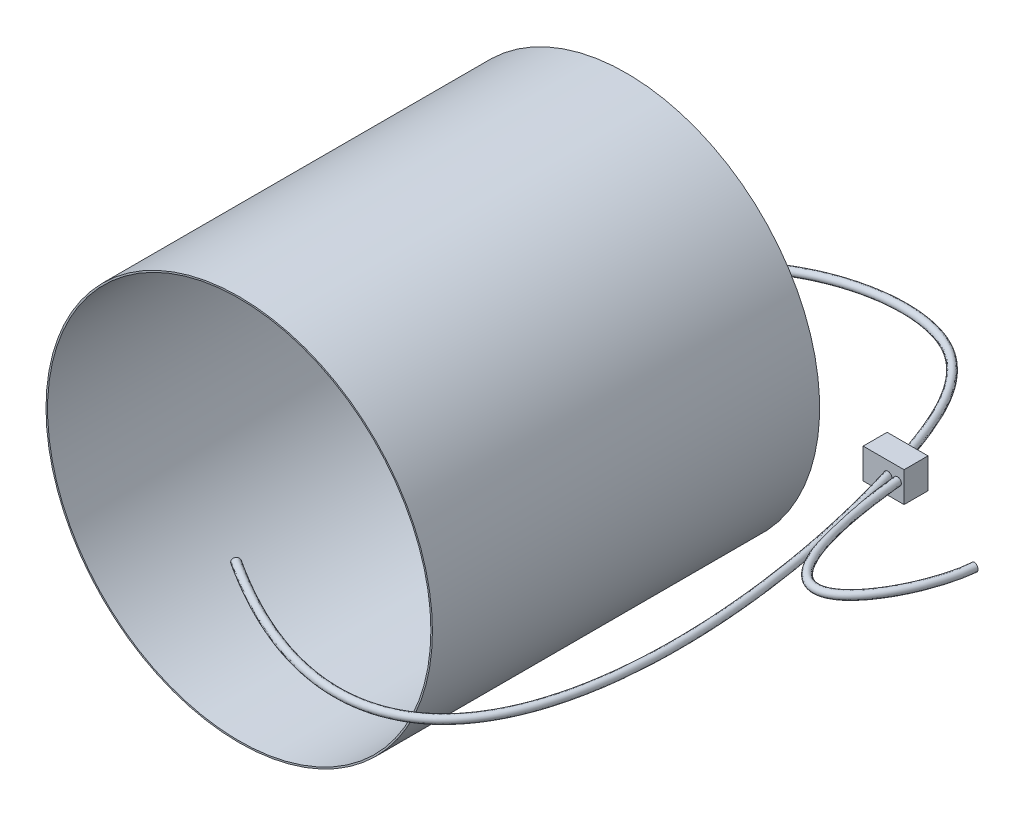
ISO-10303-21;
HEADER;
FILE_DESCRIPTION(('STEP AP214'),'2;1');
FILE_NAME('part.step','',(''),(''),'','','');
FILE_SCHEMA(('AUTOMOTIVE_DESIGN { 1 0 10303 214 1 1 1 1 }'));
ENDSEC;
DATA;
#1=APPLICATION_CONTEXT('core data for automotive mechanical design processes');
#2=APPLICATION_PROTOCOL_DEFINITION('international standard','automotive_design',2000,#1);
#3=PRODUCT_CONTEXT('',#1,'mechanical');
#4=PRODUCT('Part','Part','',(#3));
#5=PRODUCT_RELATED_PRODUCT_CATEGORY('part','',(#4));
#6=PRODUCT_DEFINITION_FORMATION('','',#4);
#7=PRODUCT_DEFINITION_CONTEXT('part definition',#1,'design');
#8=PRODUCT_DEFINITION('design','',#6,#7);
#9=PRODUCT_DEFINITION_SHAPE('','',#8);
#10=(LENGTH_UNIT() NAMED_UNIT(*) SI_UNIT(.MILLI.,.METRE.));
#11=(NAMED_UNIT(*) PLANE_ANGLE_UNIT() SI_UNIT($,.RADIAN.));
#12=(NAMED_UNIT(*) SI_UNIT($,.STERADIAN.) SOLID_ANGLE_UNIT());
#13=UNCERTAINTY_MEASURE_WITH_UNIT(LENGTH_MEASURE(1.E-05),#10,'distance_accuracy_value','');
#14=(GEOMETRIC_REPRESENTATION_CONTEXT(3) GLOBAL_UNCERTAINTY_ASSIGNED_CONTEXT((#13)) GLOBAL_UNIT_ASSIGNED_CONTEXT((#10,
#11,#12)) REPRESENTATION_CONTEXT('',''));
#15=CARTESIAN_POINT('',(0.,0.,0.));
#16=DIRECTION('',(0.,0.,1.));
#17=DIRECTION('',(1.,0.,0.));
#18=AXIS2_PLACEMENT_3D('',#15,#16,#17);
#19=CARTESIAN_POINT('',(338.302574557478,17.1512584107072,31.));
#20=DIRECTION('',(1.,0.,0.));
#21=DIRECTION('',(0.,0.,-1.));
#22=AXIS2_PLACEMENT_3D('',#19,#20,#21);
#23=PLANE('',#22);
#24=DIRECTION('',(0.,-1.,0.));
#25=VECTOR('',#24,1.);
#26=CARTESIAN_POINT('',(338.302574557478,17.1512584107072,0.));
#27=LINE('',#26,#25);
#28=CARTESIAN_POINT('',(338.302574557478,17.1512584107072,0.));
#29=VERTEX_POINT('',#28);
#30=CARTESIAN_POINT('',(338.302574557478,-21.9980250572279,0.));
#31=VERTEX_POINT('',#30);
#32=EDGE_CURVE('E99',#29,#31,#27,.T.);
#33=ORIENTED_EDGE('',*,*,#32,.T.);
#34=DIRECTION('',(0.,0.,-1.));
#35=VECTOR('',#34,1.);
#36=CARTESIAN_POINT('',(338.302574557478,-21.9980250572279,31.));
#37=LINE('',#36,#35);
#38=CARTESIAN_POINT('',(338.302574557478,-21.9980250572279,31.));
#39=VERTEX_POINT('',#38);
#40=EDGE_CURVE('E45',#39,#31,#37,.T.);
#41=ORIENTED_EDGE('',*,*,#40,.F.);
#42=DIRECTION('',(0.,-1.,0.));
#43=VECTOR('',#42,1.);
#44=CARTESIAN_POINT('',(338.302574557478,17.1512584107072,31.));
#45=LINE('',#44,#43);
#46=CARTESIAN_POINT('',(338.302574557478,17.1512584107072,31.));
#47=VERTEX_POINT('',#46);
#48=EDGE_CURVE('E105',#47,#39,#45,.T.);
#49=ORIENTED_EDGE('',*,*,#48,.F.);
#50=DIRECTION('',(0.,0.,-1.));
#51=VECTOR('',#50,1.);
#52=CARTESIAN_POINT('',(338.302574557478,17.1512584107072,31.));
#53=LINE('',#52,#51);
#54=EDGE_CURVE('E110',#47,#29,#53,.T.);
#55=ORIENTED_EDGE('',*,*,#54,.T.);
#56=EDGE_LOOP('',(#33,#41,#49,#55));
#57=FACE_BOUND('',#56,.T.);
#58=ADVANCED_FACE('F42',(#57),#23,.F.);
#59=CARTESIAN_POINT('',(338.302574557478,-21.9980250572279,31.));
#60=DIRECTION('',(0.,1.,0.));
#61=DIRECTION('',(0.,0.,1.));
#62=AXIS2_PLACEMENT_3D('',#59,#60,#61);
#63=PLANE('',#62);
#64=DIRECTION('',(1.,0.,0.));
#65=VECTOR('',#64,1.);
#66=CARTESIAN_POINT('',(338.302574557478,-21.9980250572279,0.));
#67=LINE('',#66,#65);
#68=CARTESIAN_POINT('',(391.218351464605,-21.9980250572279,0.));
#69=VERTEX_POINT('',#68);
#70=EDGE_CURVE('E102',#31,#69,#67,.T.);
#71=ORIENTED_EDGE('',*,*,#70,.T.);
#72=DIRECTION('',(0.,0.,-1.));
#73=VECTOR('',#72,1.);
#74=CARTESIAN_POINT('',(391.218351464605,-21.9980250572279,31.));
#75=LINE('',#74,#73);
#76=CARTESIAN_POINT('',(391.218351464605,-21.9980250572279,31.));
#77=VERTEX_POINT('',#76);
#78=EDGE_CURVE('E117',#77,#69,#75,.T.);
#79=ORIENTED_EDGE('',*,*,#78,.F.);
#80=DIRECTION('',(1.,0.,0.));
#81=VECTOR('',#80,1.);
#82=CARTESIAN_POINT('',(338.302574557478,-21.9980250572279,31.));
#83=LINE('',#82,#81);
#84=EDGE_CURVE('E91',#39,#77,#83,.T.);
#85=ORIENTED_EDGE('',*,*,#84,.F.);
#86=ORIENTED_EDGE('',*,*,#40,.T.);
#87=EDGE_LOOP('',(#71,#79,#85,#86));
#88=FACE_BOUND('',#87,.T.);
#89=ADVANCED_FACE('F120',(#88),#63,.F.);
#90=CARTESIAN_POINT('',(391.218351464605,17.1512584107072,31.));
#91=DIRECTION('',(-1.,0.,0.));
#92=DIRECTION('',(0.,0.,1.));
#93=AXIS2_PLACEMENT_3D('',#90,#91,#92);
#94=PLANE('',#93);
#95=DIRECTION('',(0.,1.,0.));
#96=VECTOR('',#95,1.);
#97=CARTESIAN_POINT('',(391.218351464605,17.1512584107072,0.));
#98=LINE('',#97,#96);
#99=CARTESIAN_POINT('',(391.218351464605,17.1512584107072,0.));
#100=VERTEX_POINT('',#99);
#101=EDGE_CURVE('E77',#69,#100,#98,.T.);
#102=ORIENTED_EDGE('',*,*,#101,.T.);
#103=DIRECTION('',(0.,0.,-1.));
#104=VECTOR('',#103,1.);
#105=CARTESIAN_POINT('',(391.218351464605,17.1512584107072,31.));
#106=LINE('',#105,#104);
#107=CARTESIAN_POINT('',(391.218351464605,17.1512584107072,31.));
#108=VERTEX_POINT('',#107);
#109=EDGE_CURVE('E116',#108,#100,#106,.T.);
#110=ORIENTED_EDGE('',*,*,#109,.F.);
#111=DIRECTION('',(0.,1.,0.));
#112=VECTOR('',#111,1.);
#113=CARTESIAN_POINT('',(391.218351464605,17.1512584107072,31.));
#114=LINE('',#113,#112);
#115=EDGE_CURVE('E108',#77,#108,#114,.T.);
#116=ORIENTED_EDGE('',*,*,#115,.F.);
#117=ORIENTED_EDGE('',*,*,#78,.T.);
#118=EDGE_LOOP('',(#102,#110,#116,#117));
#119=FACE_BOUND('',#118,.T.);
#120=ADVANCED_FACE('F145',(#119),#94,.F.);
#121=CARTESIAN_POINT('',(338.302574557478,17.1512584107072,31.));
#122=DIRECTION('',(0.,-1.,0.));
#123=DIRECTION('',(0.,0.,-1.));
#124=AXIS2_PLACEMENT_3D('',#121,#122,#123);
#125=PLANE('',#124);
#126=DIRECTION('',(-1.,0.,0.));
#127=VECTOR('',#126,1.);
#128=CARTESIAN_POINT('',(338.302574557478,17.1512584107072,0.));
#129=LINE('',#128,#127);
#130=EDGE_CURVE('E83',#100,#29,#129,.T.);
#131=ORIENTED_EDGE('',*,*,#130,.T.);
#132=ORIENTED_EDGE('',*,*,#54,.F.);
#133=DIRECTION('',(-1.,0.,0.));
#134=VECTOR('',#133,1.);
#135=CARTESIAN_POINT('',(338.302574557478,17.1512584107072,31.));
#136=LINE('',#135,#134);
#137=EDGE_CURVE('E59',#108,#47,#136,.T.);
#138=ORIENTED_EDGE('',*,*,#137,.F.);
#139=ORIENTED_EDGE('',*,*,#109,.T.);
#140=EDGE_LOOP('',(#131,#132,#138,#139));
#141=FACE_BOUND('',#140,.T.);
#142=ADVANCED_FACE('F135',(#141),#125,.F.);
#143=CARTESIAN_POINT('',(0.,0.,31.));
#144=DIRECTION('',(0.,0.,1.));
#145=DIRECTION('',(1.,0.,0.));
#146=AXIS2_PLACEMENT_3D('',#143,#144,#145);
#147=PLANE('',#146);
#148=CARTESIAN_POINT('',(382.708659892026,0.,31.));
#149=DIRECTION('',(0.,0.,1.));
#150=DIRECTION('',(1.,0.,0.));
#151=AXIS2_PLACEMENT_3D('',#148,#149,#150);
#152=CIRCLE('',#151,4.99999999999999);
#153=CARTESIAN_POINT('',(387.708659892026,0.,31.));
#154=VERTEX_POINT('',#153);
#155=EDGE_CURVE('E12',#154,#154,#152,.T.);
#156=ORIENTED_EDGE('',*,*,#155,.F.);
#157=EDGE_LOOP('',(#156));
#158=FACE_BOUND('',#157,.T.);
#159=ORIENTED_EDGE('',*,*,#48,.T.);
#160=ORIENTED_EDGE('',*,*,#84,.T.);
#161=ORIENTED_EDGE('',*,*,#115,.T.);
#162=ORIENTED_EDGE('',*,*,#137,.T.);
#163=EDGE_LOOP('',(#159,#160,#161,#162));
#164=FACE_BOUND('',#163,.T.);
#165=ADVANCED_FACE('F127',(#158,#164),#147,.T.);
#166=CARTESIAN_POINT('',(0.,0.,0.));
#167=DIRECTION('',(0.,0.,1.));
#168=DIRECTION('',(1.,0.,0.));
#169=AXIS2_PLACEMENT_3D('',#166,#167,#168);
#170=PLANE('',#169);
#171=ORIENTED_EDGE('',*,*,#32,.F.);
#172=ORIENTED_EDGE('',*,*,#130,.F.);
#173=ORIENTED_EDGE('',*,*,#101,.F.);
#174=ORIENTED_EDGE('',*,*,#70,.F.);
#175=EDGE_LOOP('',(#171,#172,#173,#174));
#176=FACE_BOUND('',#175,.T.);
#177=ADVANCED_FACE('F125',(#176),#170,.F.);
#178=CARTESIAN_POINT('',(528.966952554239,0.,77.0978475005213));
#179=DIRECTION('',(0.178166893070489,0.,-0.984000283645086));
#180=DIRECTION('',(-0.984000283645086,0.,-0.178166893070489));
#181=AXIS2_PLACEMENT_3D('',#178,#179,#180);
#182=PLANE('',#181);
#183=CARTESIAN_POINT('',(528.966952554239,0.,77.0978475005213));
#184=DIRECTION('',(0.178166893070489,0.,-0.984000283645086));
#185=DIRECTION('',(-0.984000283645086,0.,-0.178166893070489));
#186=AXIS2_PLACEMENT_3D('',#183,#184,#185);
#187=CIRCLE('',#186,4.99999999999999);
#188=CARTESIAN_POINT('',(524.046951136013,0.,76.2070130351689));
#189=VERTEX_POINT('',#188);
#190=EDGE_CURVE('E96',#189,#189,#187,.T.);
#191=ORIENTED_EDGE('',*,*,#190,.T.);
#192=EDGE_LOOP('',(#191));
#193=FACE_BOUND('',#192,.T.);
#194=ADVANCED_FACE('F97',(#193),#182,.T.);
#195=CARTESIAN_POINT('',(387.708659892026,0.,31.));
#196=CARTESIAN_POINT('',(391.661472107941,0.,69.4023058030883));
#197=CARTESIAN_POINT('',(396.809414964593,0.,100.103749865182));
#198=CARTESIAN_POINT('',(408.727187505509,0.,148.292164886655));
#199=CARTESIAN_POINT('',(415.519472751265,0.,165.778206598089));
#200=CARTESIAN_POINT('',(426.102157344031,0.,183.622398636411));
#201=CARTESIAN_POINT('',(429.688360441044,0.,188.166708605779));
#202=CARTESIAN_POINT('',(436.724624873369,0.,194.790027303583));
#203=CARTESIAN_POINT('',(440.154819260295,0.,196.866935713956));
#204=CARTESIAN_POINT('',(446.769499376555,0.,199.178905140237));
#205=CARTESIAN_POINT('',(449.971859622662,0.,199.447610877982));
#206=CARTESIAN_POINT('',(456.563295910827,0.,198.556415249598));
#207=CARTESIAN_POINT('',(459.967239373909,0.,197.367487583561));
#208=CARTESIAN_POINT('',(466.973944309957,0.,193.519074129686));
#209=CARTESIAN_POINT('',(470.56109249647,0.,190.858574648087));
#210=CARTESIAN_POINT('',(477.698048187122,0.,184.264753590476));
#211=CARTESIAN_POINT('',(481.246497577332,0.,180.335461191755));
#212=CARTESIAN_POINT('',(491.588124472667,0.,167.078632113022));
#213=CARTESIAN_POINT('',(498.071201186594,0.,156.285751039266));
#214=CARTESIAN_POINT('',(509.301617064936,0.,133.197895495766));
#215=CARTESIAN_POINT('',(514.056249846722,0.,120.901129197843));
#216=CARTESIAN_POINT('',(521.084415400655,0.,97.2257813197254));
#217=CARTESIAN_POINT('',(523.353664153003,0.,85.8338514195964));
#218=CARTESIAN_POINT('',(524.046951136013,0.,76.2070130351689));
#219=CARTESIAN_POINT('',(387.708659892026,9.99999999999998,31.));
#220=CARTESIAN_POINT('',(391.661472107941,9.99999999999998,69.4023058030883));
#221=CARTESIAN_POINT('',(396.809414964593,9.99999999999998,100.103749865182));
#222=CARTESIAN_POINT('',(408.727187505509,9.99999999999998,148.292164886655));
#223=CARTESIAN_POINT('',(415.519472751265,9.99999999999998,165.778206598089));
#224=CARTESIAN_POINT('',(426.102157344031,9.99999999999998,183.622398636411));
#225=CARTESIAN_POINT('',(429.688360441044,9.99999999999998,188.166708605779));
#226=CARTESIAN_POINT('',(436.72462487337,9.99999999999998,194.790027303583));
#227=CARTESIAN_POINT('',(440.154819260295,9.99999999999998,196.866935713956));
#228=CARTESIAN_POINT('',(446.769499376555,9.99999999999998,199.178905140237));
#229=CARTESIAN_POINT('',(449.971859622662,9.99999999999998,199.447610877982));
#230=CARTESIAN_POINT('',(456.563295910827,9.99999999999998,198.556415249598));
#231=CARTESIAN_POINT('',(459.967239373909,9.99999999999998,197.367487583561));
#232=CARTESIAN_POINT('',(466.973944309957,9.99999999999998,193.519074129686));
#233=CARTESIAN_POINT('',(470.56109249647,9.99999999999998,190.858574648087));
#234=CARTESIAN_POINT('',(477.698048187122,9.99999999999998,184.264753590476));
#235=CARTESIAN_POINT('',(481.246497577332,9.99999999999998,180.335461191755));
#236=CARTESIAN_POINT('',(491.588124472667,9.99999999999998,167.078632113022));
#237=CARTESIAN_POINT('',(498.071201186594,9.99999999999998,156.285751039266));
#238=CARTESIAN_POINT('',(509.301617064936,9.99999999999998,133.197895495766));
#239=CARTESIAN_POINT('',(514.056249846722,9.99999999999998,120.901129197843));
#240=CARTESIAN_POINT('',(521.084415400655,9.99999999999998,97.2257813197254));
#241=CARTESIAN_POINT('',(523.353664153003,9.99999999999998,85.8338514195964));
#242=CARTESIAN_POINT('',(524.046951136013,9.99999999999998,76.2070130351688));
#243=CARTESIAN_POINT('',(377.708659892026,9.99999999999998,31.));
#244=CARTESIAN_POINT('',(381.661472107941,9.99999999999998,69.7417569729615));
#245=CARTESIAN_POINT('',(386.81845239686,9.99999999999998,100.864618812219));
#246=CARTESIAN_POINT('',(398.911140211257,9.99999999999998,150.303003053876));
#247=CARTESIAN_POINT('',(405.824392162172,9.99999999999998,168.619454697616));
#248=CARTESIAN_POINT('',(417.301986332703,9.99999999999998,188.425919195469));
#249=CARTESIAN_POINT('',(421.319538313041,9.99999999999998,193.756314151096));
#250=CARTESIAN_POINT('',(429.816693764479,9.99999999999998,202.108590123261));
#251=CARTESIAN_POINT('',(434.316164181494,9.99999999999998,205.1325714543));
#252=CARTESIAN_POINT('',(443.711975466634,9.99999999999998,208.825778978414));
#253=CARTESIAN_POINT('',(448.590441820276,9.99999999999998,209.461360447702));
#254=CARTESIAN_POINT('',(458.137072597184,9.99999999999998,208.541740609979));
#255=CARTESIAN_POINT('',(462.790369599453,9.99999999999998,207.015565599186));
#256=CARTESIAN_POINT('',(471.699811533746,9.99999999999998,202.391596469071));
#257=CARTESIAN_POINT('',(475.971569750655,9.99999999999998,199.294816040627));
#258=CARTESIAN_POINT('',(484.179344876291,9.99999999999998,191.909112699167));
#259=CARTESIAN_POINT('',(488.116719899132,9.99999999999998,187.616160604542));
#260=CARTESIAN_POINT('',(499.410821362281,9.99999999999998,173.3746283122));
#261=CARTESIAN_POINT('',(506.255903714969,9.99999999999998,162.059764603428));
#262=CARTESIAN_POINT('',(518.092502860762,9.99999999999998,137.998824061341));
#263=CARTESIAN_POINT('',(523.07672603836,9.99999999999998,125.254539052342));
#264=CARTESIAN_POINT('',(530.538985855073,9.99999999999998,100.532178997147));
#265=CARTESIAN_POINT('',(533.021306516796,9.99999999999998,88.5674522716136));
#266=CARTESIAN_POINT('',(533.886953972464,9.99999999999998,77.9886819658738));
#267=CARTESIAN_POINT('',(377.708659892026,0.,31.));
#268=CARTESIAN_POINT('',(381.661472107941,0.,69.7417569729615));
#269=CARTESIAN_POINT('',(386.81845239686,0.,100.864618812219));
#270=CARTESIAN_POINT('',(398.911140211257,0.,150.303003053876));
#271=CARTESIAN_POINT('',(405.824392162172,0.,168.619454697616));
#272=CARTESIAN_POINT('',(417.301986332703,0.,188.425919195469));
#273=CARTESIAN_POINT('',(421.319538313041,0.,193.756314151096));
#274=CARTESIAN_POINT('',(429.816693764479,0.,202.108590123261));
#275=CARTESIAN_POINT('',(434.316164181494,0.,205.1325714543));
#276=CARTESIAN_POINT('',(443.711975466634,0.,208.825778978414));
#277=CARTESIAN_POINT('',(448.590441820276,0.,209.461360447702));
#278=CARTESIAN_POINT('',(458.137072597184,0.,208.541740609979));
#279=CARTESIAN_POINT('',(462.790369599453,0.,207.015565599186));
#280=CARTESIAN_POINT('',(471.699811533746,0.,202.391596469071));
#281=CARTESIAN_POINT('',(475.971569750655,0.,199.294816040627));
#282=CARTESIAN_POINT('',(484.179344876291,0.,191.909112699167));
#283=CARTESIAN_POINT('',(488.116719899132,0.,187.616160604542));
#284=CARTESIAN_POINT('',(499.410821362281,0.,173.3746283122));
#285=CARTESIAN_POINT('',(506.255903714969,0.,162.059764603428));
#286=CARTESIAN_POINT('',(518.092502860762,0.,137.998824061341));
#287=CARTESIAN_POINT('',(523.07672603836,0.,125.254539052342));
#288=CARTESIAN_POINT('',(530.538985855073,0.,100.532178997147));
#289=CARTESIAN_POINT('',(533.021306516796,0.,88.5674522716136));
#290=CARTESIAN_POINT('',(533.886953972464,0.,77.9886819658738));
#291=CARTESIAN_POINT('',(377.708659892026,-9.99999999999998,31.));
#292=CARTESIAN_POINT('',(381.661472107941,-9.99999999999998,69.7417569729615));
#293=CARTESIAN_POINT('',(386.81845239686,-9.99999999999998,100.864618812219));
#294=CARTESIAN_POINT('',(398.911140211257,-9.99999999999998,150.303003053876));
#295=CARTESIAN_POINT('',(405.824392162172,-9.99999999999998,168.619454697616));
#296=CARTESIAN_POINT('',(417.301986332703,-9.99999999999998,188.425919195469));
#297=CARTESIAN_POINT('',(421.319538313041,-9.99999999999998,193.756314151096));
#298=CARTESIAN_POINT('',(429.816693764479,-9.99999999999998,202.108590123261));
#299=CARTESIAN_POINT('',(434.316164181494,-9.99999999999998,205.1325714543));
#300=CARTESIAN_POINT('',(443.711975466634,-9.99999999999998,208.825778978414));
#301=CARTESIAN_POINT('',(448.590441820276,-9.99999999999998,209.461360447702));
#302=CARTESIAN_POINT('',(458.137072597184,-9.99999999999998,208.541740609979));
#303=CARTESIAN_POINT('',(462.790369599453,-9.99999999999998,207.015565599186));
#304=CARTESIAN_POINT('',(471.699811533746,-9.99999999999998,202.391596469071));
#305=CARTESIAN_POINT('',(475.971569750655,-9.99999999999998,199.294816040627));
#306=CARTESIAN_POINT('',(484.179344876291,-9.99999999999998,191.909112699167));
#307=CARTESIAN_POINT('',(488.116719899132,-9.99999999999998,187.616160604542));
#308=CARTESIAN_POINT('',(499.410821362281,-9.99999999999998,173.3746283122));
#309=CARTESIAN_POINT('',(506.255903714969,-9.99999999999998,162.059764603428));
#310=CARTESIAN_POINT('',(518.092502860762,-9.99999999999998,137.998824061341));
#311=CARTESIAN_POINT('',(523.07672603836,-9.99999999999998,125.254539052342));
#312=CARTESIAN_POINT('',(530.538985855073,-9.99999999999998,100.532178997147));
#313=CARTESIAN_POINT('',(533.021306516796,-9.99999999999998,88.5674522716136));
#314=CARTESIAN_POINT('',(533.886953972464,-9.99999999999998,77.9886819658738));
#315=CARTESIAN_POINT('',(387.708659892026,-9.99999999999998,31.));
#316=CARTESIAN_POINT('',(391.661472107941,-9.99999999999998,69.4023058030883));
#317=CARTESIAN_POINT('',(396.809414964593,-9.99999999999998,100.103749865182));
#318=CARTESIAN_POINT('',(408.727187505509,-9.99999999999998,148.292164886655));
#319=CARTESIAN_POINT('',(415.519472751265,-9.99999999999998,165.778206598089));
#320=CARTESIAN_POINT('',(426.102157344031,-9.99999999999998,183.622398636411));
#321=CARTESIAN_POINT('',(429.688360441044,-9.99999999999998,188.166708605779));
#322=CARTESIAN_POINT('',(436.72462487337,-9.99999999999998,194.790027303583));
#323=CARTESIAN_POINT('',(440.154819260295,-9.99999999999998,196.866935713956));
#324=CARTESIAN_POINT('',(446.769499376555,-9.99999999999998,199.178905140237));
#325=CARTESIAN_POINT('',(449.971859622662,-9.99999999999998,199.447610877982));
#326=CARTESIAN_POINT('',(456.563295910827,-9.99999999999998,198.556415249598));
#327=CARTESIAN_POINT('',(459.967239373909,-9.99999999999998,197.367487583561));
#328=CARTESIAN_POINT('',(466.973944309957,-9.99999999999998,193.519074129686));
#329=CARTESIAN_POINT('',(470.56109249647,-9.99999999999998,190.858574648087));
#330=CARTESIAN_POINT('',(477.698048187122,-9.99999999999998,184.264753590476));
#331=CARTESIAN_POINT('',(481.246497577332,-9.99999999999998,180.335461191755));
#332=CARTESIAN_POINT('',(491.588124472667,-9.99999999999998,167.078632113022));
#333=CARTESIAN_POINT('',(498.071201186594,-9.99999999999998,156.285751039266));
#334=CARTESIAN_POINT('',(509.301617064936,-9.99999999999998,133.197895495766));
#335=CARTESIAN_POINT('',(514.056249846722,-9.99999999999998,120.901129197843));
#336=CARTESIAN_POINT('',(521.084415400655,-9.99999999999998,97.2257813197254));
#337=CARTESIAN_POINT('',(523.353664153003,-9.99999999999998,85.8338514195964));
#338=CARTESIAN_POINT('',(524.046951136013,-9.99999999999998,76.2070130351688));
#339=CARTESIAN_POINT('',(387.708659892026,0.,31.));
#340=CARTESIAN_POINT('',(391.661472107941,0.,69.4023058030883));
#341=CARTESIAN_POINT('',(396.809414964593,0.,100.103749865182));
#342=CARTESIAN_POINT('',(408.727187505509,0.,148.292164886655));
#343=CARTESIAN_POINT('',(415.519472751265,0.,165.778206598089));
#344=CARTESIAN_POINT('',(426.102157344031,0.,183.622398636411));
#345=CARTESIAN_POINT('',(429.688360441044,0.,188.166708605779));
#346=CARTESIAN_POINT('',(436.724624873369,0.,194.790027303583));
#347=CARTESIAN_POINT('',(440.154819260295,0.,196.866935713956));
#348=CARTESIAN_POINT('',(446.769499376555,0.,199.178905140237));
#349=CARTESIAN_POINT('',(449.971859622662,0.,199.447610877982));
#350=CARTESIAN_POINT('',(456.563295910827,0.,198.556415249598));
#351=CARTESIAN_POINT('',(459.967239373909,0.,197.367487583561));
#352=CARTESIAN_POINT('',(466.973944309957,0.,193.519074129686));
#353=CARTESIAN_POINT('',(470.56109249647,0.,190.858574648087));
#354=CARTESIAN_POINT('',(477.698048187122,0.,184.264753590476));
#355=CARTESIAN_POINT('',(481.246497577332,0.,180.335461191755));
#356=CARTESIAN_POINT('',(491.588124472667,0.,167.078632113022));
#357=CARTESIAN_POINT('',(498.071201186594,0.,156.285751039266));
#358=CARTESIAN_POINT('',(509.301617064936,0.,133.197895495766));
#359=CARTESIAN_POINT('',(514.056249846722,0.,120.901129197843));
#360=CARTESIAN_POINT('',(521.084415400655,0.,97.2257813197254));
#361=CARTESIAN_POINT('',(523.353664153003,0.,85.8338514195964));
#362=CARTESIAN_POINT('',(524.046951136013,0.,76.2070130351689));
#363=(BOUNDED_SURFACE() B_SPLINE_SURFACE(3,3,((#195,#196,#197,#198,#199,#200,#201,#202,#203,
#204,#205,#206,#207,#208,#209,#210,#211,#212,#213,#214,#215,#216,#217,#218),(#219,#220,#221,
#222,#223,#224,#225,#226,#227,#228,#229,#230,#231,#232,#233,#234,#235,#236,#237,#238,#239,#240,
#241,#242),(#243,#244,#245,#246,#247,#248,#249,#250,#251,#252,#253,#254,#255,#256,#257,#258,
#259,#260,#261,#262,#263,#264,#265,#266),(#267,#268,#269,#270,#271,#272,#273,#274,#275,#276,
#277,#278,#279,#280,#281,#282,#283,#284,#285,#286,#287,#288,#289,#290),(#291,#292,#293,#294,
#295,#296,#297,#298,#299,#300,#301,#302,#303,#304,#305,#306,#307,#308,#309,#310,#311,#312,#313,
#314),(#315,#316,#317,#318,#319,#320,#321,#322,#323,#324,#325,#326,#327,#328,#329,#330,#331,
#332,#333,#334,#335,#336,#337,#338),(#339,#340,#341,#342,#343,#344,#345,#346,#347,#348,#349,
#350,#351,#352,#353,#354,#355,#356,#357,#358,#359,#360,#361,#362)),.UNSPECIFIED.,.T.,.F.,
.F.) B_SPLINE_SURFACE_WITH_KNOTS((4,3,4),(4,2,2,2,2,2,2,2,2,2,2,4),(0.,0.5,1.),(0.,0.125,0.25,
0.3125,0.375,0.4375,0.5,0.5625,0.625,0.75,0.875,1.),
.UNSPECIFIED.) GEOMETRIC_REPRESENTATION_ITEM() RATIONAL_B_SPLINE_SURFACE(((1.,1.,1.,1.,1.,1.,1.,
1.,1.,1.,1.,1.,1.,1.,1.,1.,1.,1.,1.,1.,1.,1.,1.,1.),(0.333333333333333,0.333333333333333,
0.333333333333333,0.333333333333333,0.333333333333333,0.333333333333333,0.333333333333333,
0.333333333333333,0.333333333333333,0.333333333333333,0.333333333333333,0.333333333333333,
0.333333333333333,0.333333333333333,0.333333333333333,0.333333333333333,0.333333333333333,
0.333333333333333,0.333333333333333,0.333333333333333,0.333333333333333,0.333333333333333,
0.333333333333333,0.333333333333333),(0.333333333333333,0.333333333333333,0.333333333333333,
0.333333333333333,0.333333333333333,0.333333333333333,0.333333333333333,0.333333333333333,
0.333333333333333,0.333333333333333,0.333333333333333,0.333333333333333,0.333333333333333,
0.333333333333333,0.333333333333333,0.333333333333333,0.333333333333333,0.333333333333333,
0.333333333333333,0.333333333333333,0.333333333333333,0.333333333333333,0.333333333333333,
0.333333333333333),(1.,1.,1.,1.,1.,1.,1.,1.,1.,1.,1.,1.,1.,1.,1.,1.,1.,1.,1.,1.,1.,1.,1.,1.),
(0.333333333333333,0.333333333333333,0.333333333333333,0.333333333333333,0.333333333333333,
0.333333333333333,0.333333333333333,0.333333333333333,0.333333333333333,0.333333333333333,
0.333333333333333,0.333333333333333,0.333333333333333,0.333333333333333,0.333333333333333,
0.333333333333333,0.333333333333333,0.333333333333333,0.333333333333333,0.333333333333333,
0.333333333333333,0.333333333333333,0.333333333333333,0.333333333333333),(0.333333333333333,
0.333333333333333,0.333333333333333,0.333333333333333,0.333333333333333,0.333333333333333,
0.333333333333333,0.333333333333333,0.333333333333333,0.333333333333333,0.333333333333333,
0.333333333333333,0.333333333333333,0.333333333333333,0.333333333333333,0.333333333333333,
0.333333333333333,0.333333333333333,0.333333333333333,0.333333333333333,0.333333333333333,
0.333333333333333,0.333333333333333,0.333333333333333),(1.,1.,1.,1.,1.,1.,1.,1.,1.,1.,1.,1.,1.,
1.,1.,1.,1.,1.,1.,1.,1.,1.,1.,1.))) REPRESENTATION_ITEM('') SURFACE());
#364=ORIENTED_EDGE('',*,*,#190,.F.);
#365=EDGE_LOOP('',(#364));
#366=FACE_BOUND('',#365,.T.);
#367=ORIENTED_EDGE('',*,*,#155,.T.);
#368=EDGE_LOOP('',(#367));
#369=FACE_BOUND('',#368,.T.);
#370=ADVANCED_FACE('F129',(#366,#369),#363,.T.);
#371=CLOSED_SHELL('',(#58,#89,#120,#142,#165,#177,#194,#370));
#372=MANIFOLD_SOLID_BREP('B2',#371);
#373=CARTESIAN_POINT('',(0.,0.,500.));
#374=DIRECTION('',(0.,0.,1.));
#375=DIRECTION('',(1.,0.,0.));
#376=AXIS2_PLACEMENT_3D('',#373,#374,#375);
#377=PLANE('',#376);
#378=CARTESIAN_POINT('',(0.,0.,500.));
#379=DIRECTION('',(0.,0.,1.));
#380=DIRECTION('',(1.,0.,0.));
#381=AXIS2_PLACEMENT_3D('',#378,#379,#380);
#382=CIRCLE('',#381,250.);
#383=CARTESIAN_POINT('',(250.,0.,500.));
#384=VERTEX_POINT('',#383);
#385=EDGE_CURVE('E211',#384,#384,#382,.T.);
#386=ORIENTED_EDGE('',*,*,#385,.T.);
#387=EDGE_LOOP('',(#386));
#388=FACE_BOUND('',#387,.T.);
#389=CARTESIAN_POINT('',(0.,0.,500.));
#390=DIRECTION('',(0.,0.,1.));
#391=DIRECTION('',(1.,0.,0.));
#392=AXIS2_PLACEMENT_3D('',#389,#390,#391);
#393=CIRCLE('',#392,248.);
#394=CARTESIAN_POINT('',(248.,0.,500.));
#395=VERTEX_POINT('',#394);
#396=EDGE_CURVE('E224',#395,#395,#393,.T.);
#397=ORIENTED_EDGE('',*,*,#396,.F.);
#398=EDGE_LOOP('',(#397));
#399=FACE_BOUND('',#398,.T.);
#400=ADVANCED_FACE('F204',(#388,#399),#377,.T.);
#401=CARTESIAN_POINT('',(0.,0.,500.));
#402=DIRECTION('',(0.,0.,-1.));
#403=DIRECTION('',(-1.,0.,0.));
#404=AXIS2_PLACEMENT_3D('',#401,#402,#403);
#405=CYLINDRICAL_SURFACE('',#404,250.);
#406=ORIENTED_EDGE('',*,*,#385,.F.);
#407=EDGE_LOOP('',(#406));
#408=FACE_BOUND('',#407,.T.);
#409=CARTESIAN_POINT('',(0.,0.,-1.));
#410=DIRECTION('',(0.,0.,-1.));
#411=DIRECTION('',(-1.,0.,0.));
#412=AXIS2_PLACEMENT_3D('',#409,#410,#411);
#413=CIRCLE('',#412,250.);
#414=CARTESIAN_POINT('',(-250.,0.,-1.));
#415=VERTEX_POINT('',#414);
#416=EDGE_CURVE('E218',#415,#415,#413,.T.);
#417=ORIENTED_EDGE('',*,*,#416,.F.);
#418=EDGE_LOOP('',(#417));
#419=FACE_BOUND('',#418,.T.);
#420=ADVANCED_FACE('F206',(#408,#419),#405,.T.);
#421=CARTESIAN_POINT('',(0.,0.,500.));
#422=DIRECTION('',(0.,0.,-1.));
#423=DIRECTION('',(-1.,0.,0.));
#424=AXIS2_PLACEMENT_3D('',#421,#422,#423);
#425=CYLINDRICAL_SURFACE('',#424,248.);
#426=ORIENTED_EDGE('',*,*,#396,.T.);
#427=EDGE_LOOP('',(#426));
#428=FACE_BOUND('',#427,.T.);
#429=CARTESIAN_POINT('',(0.,0.,0.));
#430=DIRECTION('',(0.,0.,1.));
#431=DIRECTION('',(1.,0.,0.));
#432=AXIS2_PLACEMENT_3D('',#429,#430,#431);
#433=CIRCLE('',#432,248.);
#434=CARTESIAN_POINT('',(248.,0.,0.));
#435=VERTEX_POINT('',#434);
#436=EDGE_CURVE('E221',#435,#435,#433,.T.);
#437=ORIENTED_EDGE('',*,*,#436,.F.);
#438=EDGE_LOOP('',(#437));
#439=FACE_BOUND('',#438,.T.);
#440=ADVANCED_FACE('F235',(#428,#439),#425,.F.);
#441=CARTESIAN_POINT('',(0.,0.,0.));
#442=DIRECTION('',(0.,0.,-1.));
#443=DIRECTION('',(-1.,0.,0.));
#444=AXIS2_PLACEMENT_3D('',#441,#442,#443);
#445=PLANE('',#444);
#446=ORIENTED_EDGE('',*,*,#436,.T.);
#447=EDGE_LOOP('',(#446));
#448=FACE_BOUND('',#447,.T.);
#449=ADVANCED_FACE('F240',(#448),#445,.F.);
#450=CARTESIAN_POINT('',(0.,0.,-1.));
#451=DIRECTION('',(0.,0.,-1.));
#452=DIRECTION('',(-1.,0.,0.));
#453=AXIS2_PLACEMENT_3D('',#450,#451,#452);
#454=PLANE('',#453);
#455=CARTESIAN_POINT('',(-4.40661829942401E-10,0.,-1.00000000445586));
#456=DIRECTION('',(3.47080220466922E-11,0.,-1.));
#457=DIRECTION('',(-1.,0.,-3.47080220466922E-11));
#458=AXIS2_PLACEMENT_3D('',#455,#456,#457);
#459=CIRCLE('',#458,5.);
#460=CARTESIAN_POINT('',(-5.00000000044066,0.,-1.0000000046294));
#461=VERTEX_POINT('',#460);
#462=EDGE_CURVE('E40',#461,#461,#459,.T.);
#463=ORIENTED_EDGE('',*,*,#462,.F.);
#464=EDGE_LOOP('',(#463));
#465=FACE_BOUND('',#464,.T.);
#466=ORIENTED_EDGE('',*,*,#416,.T.);
#467=EDGE_LOOP('',(#466));
#468=FACE_BOUND('',#467,.T.);
#469=ADVANCED_FACE('F238',(#465,#468),#454,.T.);
#470=CARTESIAN_POINT('',(45.2080586937935,0.,549.299290960078));
#471=DIRECTION('',(-0.781606245692834,0.,-0.623772135233655));
#472=DIRECTION('',(-0.623772135233655,0.,0.781606245692834));
#473=AXIS2_PLACEMENT_3D('',#470,#471,#472);
#474=PLANE('',#473);
#475=CARTESIAN_POINT('',(45.2080586937935,0.,549.299290960078));
#476=DIRECTION('',(-0.781606245692834,0.,-0.623772135233655));
#477=DIRECTION('',(-0.623772135233655,0.,0.781606245692834));
#478=AXIS2_PLACEMENT_3D('',#475,#476,#477);
#479=CIRCLE('',#478,5.);
#480=CARTESIAN_POINT('',(42.0891980176252,0.,553.207322188542));
#481=VERTEX_POINT('',#480);
#482=EDGE_CURVE('E215',#481,#481,#479,.T.);
#483=ORIENTED_EDGE('',*,*,#482,.T.);
#484=EDGE_LOOP('',(#483));
#485=FACE_BOUND('',#484,.T.);
#486=ADVANCED_FACE('F216',(#485),#474,.T.);
#487=CARTESIAN_POINT('',(-5.,0.,-1.));
#488=CARTESIAN_POINT('',(-6.54909465928698,0.,-17.2740952203217));
#489=CARTESIAN_POINT('',(-5.00277484579417,0.,-32.7646838591226));
#490=CARTESIAN_POINT('',(3.16335306004645,0.,-61.7091384377921));
#491=CARTESIAN_POINT('',(9.7747478097388,0.,-75.1596898428359));
#492=CARTESIAN_POINT('',(35.3843356319502,0.,-111.986550501211));
#493=CARTESIAN_POINT('',(60.1189827147275,0.,-131.862038134795));
#494=CARTESIAN_POINT('',(116.166648586704,0.,-160.564794775502));
#495=CARTESIAN_POINT('',(147.507317120656,0.,-169.402032485086));
#496=CARTESIAN_POINT('',(193.269404236229,0.,-172.792523953322));
#497=CARTESIAN_POINT('',(208.317356085787,0.,-172.274956074041));
#498=CARTESIAN_POINT('',(236.958601259528,0.,-167.614662016504));
#499=CARTESIAN_POINT('',(250.555793813473,0.,-163.470462053281));
#500=CARTESIAN_POINT('',(276.201293034602,0.,-150.668162924177));
#501=CARTESIAN_POINT('',(287.908192193769,0.,-141.726702628159));
#502=CARTESIAN_POINT('',(308.644851072316,0.,-120.391136562647));
#503=CARTESIAN_POINT('',(317.68492329222,0.,-107.999501319317));
#504=CARTESIAN_POINT('',(341.915610763559,0.,-67.0960259593582));
#505=CARTESIAN_POINT('',(354.245927182323,0.,-34.8414785916378));
#506=CARTESIAN_POINT('',(393.111397244784,0.,82.3045785140346));
#507=CARTESIAN_POINT('',(413.924240727186,0.,175.762596347721));
#508=CARTESIAN_POINT('',(427.375507672089,0.,309.423641010071));
#509=CARTESIAN_POINT('',(428.897129520728,0.,352.889505065755));
#510=CARTESIAN_POINT('',(424.720355988352,0.,434.077654596827));
#511=CARTESIAN_POINT('',(419.028001547594,0.,471.802014282581));
#512=CARTESIAN_POINT('',(398.994866947856,0.,537.971955237034));
#513=CARTESIAN_POINT('',(384.644579996592,0.,566.450059422594));
#514=CARTESIAN_POINT('',(355.363456958333,0.,599.297502034288));
#515=CARTESIAN_POINT('',(344.308102654319,0.,608.590632128719));
#516=CARTESIAN_POINT('',(319.511270659473,0.,623.284487000155));
#517=CARTESIAN_POINT('',(305.774823497741,0.,628.679809048322));
#518=CARTESIAN_POINT('',(275.633240006097,0.,635.086418701683));
#519=CARTESIAN_POINT('',(259.232816133353,0.,636.10208001257));
#520=CARTESIAN_POINT('',(223.695675506825,0.,633.390640933576));
#521=CARTESIAN_POINT('',(204.556179921542,0.,629.666386961075));
#522=CARTESIAN_POINT('',(142.764173084264,0.,610.810680769707));
#523=CARTESIAN_POINT('',(95.726542114445,0.,588.005360969673));
#524=CARTESIAN_POINT('',(42.0891980176252,0.,553.207322188542));
#525=CARTESIAN_POINT('',(-5.,10.,-1.));
#526=CARTESIAN_POINT('',(-6.54909465928699,10.,-17.2740952203217));
#527=CARTESIAN_POINT('',(-5.00277484579417,10.,-32.7646838591226));
#528=CARTESIAN_POINT('',(3.16335306004645,10.,-61.7091384377921));
#529=CARTESIAN_POINT('',(9.7747478097388,10.,-75.1596898428359));
#530=CARTESIAN_POINT('',(35.3843356319502,10.,-111.986550501211));
#531=CARTESIAN_POINT('',(60.1189827147275,10.,-131.862038134795));
#532=CARTESIAN_POINT('',(116.166648586704,10.,-160.564794775502));
#533=CARTESIAN_POINT('',(147.507317120656,10.,-169.402032485086));
#534=CARTESIAN_POINT('',(193.269404236229,10.,-172.792523953322));
#535=CARTESIAN_POINT('',(208.317356085787,10.,-172.274956074041));
#536=CARTESIAN_POINT('',(236.958601259528,10.,-167.614662016504));
#537=CARTESIAN_POINT('',(250.555793813473,10.,-163.470462053281));
#538=CARTESIAN_POINT('',(276.201293034602,10.,-150.668162924177));
#539=CARTESIAN_POINT('',(287.908192193769,10.,-141.726702628159));
#540=CARTESIAN_POINT('',(308.644851072316,10.,-120.391136562647));
#541=CARTESIAN_POINT('',(317.68492329222,10.,-107.999501319317));
#542=CARTESIAN_POINT('',(341.915610763559,10.,-67.0960259593582));
#543=CARTESIAN_POINT('',(354.245927182323,10.,-34.8414785916378));
#544=CARTESIAN_POINT('',(393.111397244784,10.,82.3045785140346));
#545=CARTESIAN_POINT('',(413.924240727186,10.,175.762596347721));
#546=CARTESIAN_POINT('',(427.375507672089,10.,309.423641010071));
#547=CARTESIAN_POINT('',(428.897129520729,10.,352.889505065755));
#548=CARTESIAN_POINT('',(424.720355988352,10.,434.077654596827));
#549=CARTESIAN_POINT('',(419.028001547594,10.,471.802014282581));
#550=CARTESIAN_POINT('',(398.994866947856,10.,537.971955237034));
#551=CARTESIAN_POINT('',(384.644579996592,10.,566.450059422594));
#552=CARTESIAN_POINT('',(355.363456958333,10.,599.297502034288));
#553=CARTESIAN_POINT('',(344.308102654319,10.,608.590632128719));
#554=CARTESIAN_POINT('',(319.511270659473,10.,623.284487000155));
#555=CARTESIAN_POINT('',(305.774823497741,10.,628.679809048322));
#556=CARTESIAN_POINT('',(275.633240006097,10.,635.086418701683));
#557=CARTESIAN_POINT('',(259.232816133353,10.,636.10208001257));
#558=CARTESIAN_POINT('',(223.695675506825,10.,633.390640933576));
#559=CARTESIAN_POINT('',(204.556179921542,10.,629.666386961075));
#560=CARTESIAN_POINT('',(142.764173084264,10.,610.810680769707));
#561=CARTESIAN_POINT('',(95.726542114445,10.,588.005360969673));
#562=CARTESIAN_POINT('',(42.0891980176252,10.,553.207322188542));
#563=CARTESIAN_POINT('',(5.,10.,-1.));
#564=CARTESIAN_POINT('',(3.45090534079493,10.,-16.0539762356038));
#565=CARTESIAN_POINT('',(4.75613153345842,10.,-30.2729413980244));
#566=CARTESIAN_POINT('',(12.0537086156164,10.,-56.9755761104141));
#567=CARTESIAN_POINT('',(18.0544728483989,10.,-69.4625601958502));
#568=CARTESIAN_POINT('',(41.7139949241593,10.,-103.987804038732));
#569=CARTESIAN_POINT('',(65.0689317111248,10.,-123.066383447717));
#570=CARTESIAN_POINT('',(118.576593387747,10.,-150.763891628119));
#571=CARTESIAN_POINT('',(148.701668535685,10.,-159.372851695597));
#572=CARTESIAN_POINT('',(192.337170753777,10.,-162.810856938717));
#573=CARTESIAN_POINT('',(206.621577652475,10.,-162.381123727867));
#574=CARTESIAN_POINT('',(233.572516901232,10.,-158.164899284015));
#575=CARTESIAN_POINT('',(246.235150024844,10.,-154.379881836308));
#576=CARTESIAN_POINT('',(269.860201436935,10.,-142.837265941859));
#577=CARTESIAN_POINT('',(280.713770429572,10.,-134.713579134862));
#578=CARTESIAN_POINT('',(300.235169763836,10.,-114.893785752495));
#579=CARTESIAN_POINT('',(308.892687606279,10.,-103.195208649228));
#580=CARTESIAN_POINT('',(332.333992570434,10.,-63.9765486918168));
#581=CARTESIAN_POINT('',(344.557300777524,10.,-32.3476748081995));
#582=CARTESIAN_POINT('',(383.195114845429,10.,83.7906503152135));
#583=CARTESIAN_POINT('',(403.926114297942,10.,176.629362229435));
#584=CARTESIAN_POINT('',(417.374606831523,10.,309.023096203798));
#585=CARTESIAN_POINT('',(418.91690399173,10.,352.010439027645));
#586=CARTESIAN_POINT('',(414.922866867907,10.,431.983170022424));
#587=CARTESIAN_POINT('',(409.380491646815,10.,468.966483981921));
#588=CARTESIAN_POINT('',(390.15220456267,10.,533.184262542445));
#589=CARTESIAN_POINT('',(376.475799488181,10.,560.386204208463));
#590=CARTESIAN_POINT('',(349.252927453245,10.,591.326538607559));
#591=CARTESIAN_POINT('',(339.062957224085,10.,600.007285556362));
#592=CARTESIAN_POINT('',(316.236156929682,10.,613.7734923619));
#593=CARTESIAN_POINT('',(303.594296334346,10.,618.864354944394));
#594=CARTESIAN_POINT('',(275.534616873329,10.,625.032160328388));
#595=CARTESIAN_POINT('',(260.11208555318,10.,626.104729415955));
#596=CARTESIAN_POINT('',(226.247004140677,10.,623.684413251256));
#597=CARTESIAN_POINT('',(207.807232884582,10.,620.188681571827));
#598=CARTESIAN_POINT('',(147.759475401494,10.,602.056714007618));
#599=CARTESIAN_POINT('',(101.434645105895,10.,579.766628949339));
#600=CARTESIAN_POINT('',(48.3269193699618,10.,545.391259731614));
#601=CARTESIAN_POINT('',(5.,0.,-1.));
#602=CARTESIAN_POINT('',(3.45090534079493,0.,-16.0539762356038));
#603=CARTESIAN_POINT('',(4.75613153347094,0.,-30.2729413980244));
#604=CARTESIAN_POINT('',(12.0537086156039,0.,-56.9755761104141));
#605=CARTESIAN_POINT('',(18.0544728483989,0.,-69.4625601958502));
#606=CARTESIAN_POINT('',(41.7139949241593,0.,-103.987804038732));
#607=CARTESIAN_POINT('',(65.0689317111248,0.,-123.066383447717));
#608=CARTESIAN_POINT('',(118.576593387747,0.,-150.763891628119));
#609=CARTESIAN_POINT('',(148.701668535685,0.,-159.372851695597));
#610=CARTESIAN_POINT('',(192.337170753777,0.,-162.810856938717));
#611=CARTESIAN_POINT('',(206.621577652475,0.,-162.381123727867));
#612=CARTESIAN_POINT('',(233.572516901232,0.,-158.164899284015));
#613=CARTESIAN_POINT('',(246.235150024844,0.,-154.379881836308));
#614=CARTESIAN_POINT('',(269.860201436935,0.,-142.837265941859));
#615=CARTESIAN_POINT('',(280.713770429572,0.,-134.713579134812));
#616=CARTESIAN_POINT('',(300.235169763836,0.,-114.893785752545));
#617=CARTESIAN_POINT('',(308.892687606279,0.,-103.195208649228));
#618=CARTESIAN_POINT('',(332.333992570434,0.,-63.9765486918168));
#619=CARTESIAN_POINT('',(344.557300777524,0.,-32.3476748081957));
#620=CARTESIAN_POINT('',(383.195114845429,0.,83.790650315204));
#621=CARTESIAN_POINT('',(403.926114297942,0.,176.629362229435));
#622=CARTESIAN_POINT('',(417.374606831523,0.,309.023096203798));
#623=CARTESIAN_POINT('',(418.91690399173,0.,352.010439027645));
#624=CARTESIAN_POINT('',(414.922866867907,0.,431.983170022424));
#625=CARTESIAN_POINT('',(409.380491646815,0.,468.966483981921));
#626=CARTESIAN_POINT('',(390.15220456267,0.,533.184262542445));
#627=CARTESIAN_POINT('',(376.47579948818,0.,560.386204208463));
#628=CARTESIAN_POINT('',(349.252927453245,0.,591.326538607559));
#629=CARTESIAN_POINT('',(339.062957224085,0.,600.007285556362));
#630=CARTESIAN_POINT('',(316.236156929682,0.,613.7734923619));
#631=CARTESIAN_POINT('',(303.594296334346,0.,618.864354944394));
#632=CARTESIAN_POINT('',(275.534616873329,0.,625.032160328388));
#633=CARTESIAN_POINT('',(260.11208555318,0.,626.104729415955));
#634=CARTESIAN_POINT('',(226.247004140677,0.,623.684413251256));
#635=CARTESIAN_POINT('',(207.807232884582,0.,620.188681571827));
#636=CARTESIAN_POINT('',(147.759475401494,0.,602.056714007618));
#637=CARTESIAN_POINT('',(101.434645105895,0.,579.766628942278));
#638=CARTESIAN_POINT('',(48.3269193699618,0.,545.391259731614));
#639=CARTESIAN_POINT('',(5.,-10.,-1.));
#640=CARTESIAN_POINT('',(3.45090534079493,-10.,-16.0539762356038));
#641=CARTESIAN_POINT('',(4.75613153348347,-10.,-30.2729413980244));
#642=CARTESIAN_POINT('',(12.0537086155914,-10.,-56.9755761104141));
#643=CARTESIAN_POINT('',(18.0544728483989,-10.,-69.4625601958502));
#644=CARTESIAN_POINT('',(41.7139949241593,-10.,-103.987804038732));
#645=CARTESIAN_POINT('',(65.0689317111248,-10.,-123.066383447717));
#646=CARTESIAN_POINT('',(118.576593387747,-10.,-150.763891628119));
#647=CARTESIAN_POINT('',(148.701668535685,-10.,-159.372851695597));
#648=CARTESIAN_POINT('',(192.337170753777,-10.,-162.810856938717));
#649=CARTESIAN_POINT('',(206.621577652475,-10.,-162.381123727867));
#650=CARTESIAN_POINT('',(233.572516901232,-10.,-158.164899284015));
#651=CARTESIAN_POINT('',(246.235150024844,-10.,-154.379881836308));
#652=CARTESIAN_POINT('',(269.860201436935,-10.,-142.837265941859));
#653=CARTESIAN_POINT('',(280.713770429572,-10.,-134.713579134762));
#654=CARTESIAN_POINT('',(300.235169763836,-10.,-114.893785752594));
#655=CARTESIAN_POINT('',(308.892687606279,-10.,-103.195208649228));
#656=CARTESIAN_POINT('',(332.333992570434,-10.,-63.9765486918168));
#657=CARTESIAN_POINT('',(344.557300777524,-10.,-32.3476748081918));
#658=CARTESIAN_POINT('',(383.195114845429,-10.,83.7906503151945));
#659=CARTESIAN_POINT('',(403.926114297942,-10.,176.629362229435));
#660=CARTESIAN_POINT('',(417.374606831523,-10.,309.023096203798));
#661=CARTESIAN_POINT('',(418.91690399173,-10.,352.010439027645));
#662=CARTESIAN_POINT('',(414.922866867907,-10.,431.983170022424));
#663=CARTESIAN_POINT('',(409.380491646815,-10.,468.966483981921));
#664=CARTESIAN_POINT('',(390.15220456267,-10.,533.184262542445));
#665=CARTESIAN_POINT('',(376.475799488181,-10.,560.386204208463));
#666=CARTESIAN_POINT('',(349.252927453245,-10.,591.326538607559));
#667=CARTESIAN_POINT('',(339.062957224085,-10.,600.007285556362));
#668=CARTESIAN_POINT('',(316.236156929682,-10.,613.7734923619));
#669=CARTESIAN_POINT('',(303.594296334346,-10.,618.864354944394));
#670=CARTESIAN_POINT('',(275.534616873329,-10.,625.032160328388));
#671=CARTESIAN_POINT('',(260.11208555318,-10.,626.104729415955));
#672=CARTESIAN_POINT('',(226.247004140677,-10.,623.684413251256));
#673=CARTESIAN_POINT('',(207.807232884582,-10.,620.188681571827));
#674=CARTESIAN_POINT('',(147.759475401494,-10.,602.056714007618));
#675=CARTESIAN_POINT('',(101.434645105895,-10.,579.766628935217));
#676=CARTESIAN_POINT('',(48.3269193699618,-10.,545.391259731614));
#677=CARTESIAN_POINT('',(-5.,-10.,-1.));
#678=CARTESIAN_POINT('',(-6.54909465928699,-10.,-17.2740952203217));
#679=CARTESIAN_POINT('',(-5.00277484579417,-10.,-32.7646838591226));
#680=CARTESIAN_POINT('',(3.16335306004645,-10.,-61.7091384377921));
#681=CARTESIAN_POINT('',(9.7747478097388,-10.,-75.1596898428359));
#682=CARTESIAN_POINT('',(35.3843356319502,-10.,-111.986550501211));
#683=CARTESIAN_POINT('',(60.1189827147275,-10.,-131.862038134795));
#684=CARTESIAN_POINT('',(116.166648586704,-10.,-160.564794775502));
#685=CARTESIAN_POINT('',(147.507317120656,-10.,-169.402032485086));
#686=CARTESIAN_POINT('',(193.269404236229,-10.,-172.792523953322));
#687=CARTESIAN_POINT('',(208.317356085787,-10.,-172.274956074041));
#688=CARTESIAN_POINT('',(236.958601259528,-10.,-167.614662016504));
#689=CARTESIAN_POINT('',(250.555793813473,-10.,-163.470462053281));
#690=CARTESIAN_POINT('',(276.201293034602,-10.,-150.668162924177));
#691=CARTESIAN_POINT('',(287.908192193769,-10.,-141.726702628159));
#692=CARTESIAN_POINT('',(308.644851072316,-10.,-120.391136562647));
#693=CARTESIAN_POINT('',(317.68492329222,-10.,-107.999501319317));
#694=CARTESIAN_POINT('',(341.915610763559,-10.,-67.0960259593582));
#695=CARTESIAN_POINT('',(354.245927182323,-10.,-34.8414785916378));
#696=CARTESIAN_POINT('',(393.111397244784,-10.,82.3045785140346));
#697=CARTESIAN_POINT('',(413.924240727186,-10.,175.762596347721));
#698=CARTESIAN_POINT('',(427.375507672089,-10.,309.423641010071));
#699=CARTESIAN_POINT('',(428.897129520729,-10.,352.889505065755));
#700=CARTESIAN_POINT('',(424.720355988352,-10.,434.077654596827));
#701=CARTESIAN_POINT('',(419.028001547594,-10.,471.802014282581));
#702=CARTESIAN_POINT('',(398.994866947856,-10.,537.971955237034));
#703=CARTESIAN_POINT('',(384.644579996592,-10.,566.450059422594));
#704=CARTESIAN_POINT('',(355.363456958333,-10.,599.297502034288));
#705=CARTESIAN_POINT('',(344.308102654319,-10.,608.590632128719));
#706=CARTESIAN_POINT('',(319.511270659473,-10.,623.284487000155));
#707=CARTESIAN_POINT('',(305.774823497741,-10.,628.679809048322));
#708=CARTESIAN_POINT('',(275.633240006097,-10.,635.086418701683));
#709=CARTESIAN_POINT('',(259.232816133353,-10.,636.10208001257));
#710=CARTESIAN_POINT('',(223.695675506825,-10.,633.390640933576));
#711=CARTESIAN_POINT('',(204.556179921542,-10.,629.666386961075));
#712=CARTESIAN_POINT('',(142.764173084264,-10.,610.810680769707));
#713=CARTESIAN_POINT('',(95.726542114445,-10.,588.005360969673));
#714=CARTESIAN_POINT('',(42.0891980176252,-10.,553.207322188542));
#715=CARTESIAN_POINT('',(-5.,0.,-1.));
#716=CARTESIAN_POINT('',(-6.54909465928698,0.,-17.2740952203217));
#717=CARTESIAN_POINT('',(-5.00277484579417,0.,-32.7646838591226));
#718=CARTESIAN_POINT('',(3.16335306004645,0.,-61.7091384377921));
#719=CARTESIAN_POINT('',(9.7747478097388,0.,-75.1596898428359));
#720=CARTESIAN_POINT('',(35.3843356319502,0.,-111.986550501211));
#721=CARTESIAN_POINT('',(60.1189827147275,0.,-131.862038134795));
#722=CARTESIAN_POINT('',(116.166648586704,0.,-160.564794775502));
#723=CARTESIAN_POINT('',(147.507317120656,0.,-169.402032485086));
#724=CARTESIAN_POINT('',(193.269404236229,0.,-172.792523953322));
#725=CARTESIAN_POINT('',(208.317356085787,0.,-172.274956074041));
#726=CARTESIAN_POINT('',(236.958601259528,0.,-167.614662016504));
#727=CARTESIAN_POINT('',(250.555793813473,0.,-163.470462053281));
#728=CARTESIAN_POINT('',(276.201293034602,0.,-150.668162924177));
#729=CARTESIAN_POINT('',(287.908192193769,0.,-141.726702628159));
#730=CARTESIAN_POINT('',(308.644851072316,0.,-120.391136562647));
#731=CARTESIAN_POINT('',(317.68492329222,0.,-107.999501319317));
#732=CARTESIAN_POINT('',(341.915610763559,0.,-67.0960259593582));
#733=CARTESIAN_POINT('',(354.245927182323,0.,-34.8414785916378));
#734=CARTESIAN_POINT('',(393.111397244784,0.,82.3045785140346));
#735=CARTESIAN_POINT('',(413.924240727186,0.,175.762596347721));
#736=CARTESIAN_POINT('',(427.375507672089,0.,309.423641010071));
#737=CARTESIAN_POINT('',(428.897129520728,0.,352.889505065755));
#738=CARTESIAN_POINT('',(424.720355988352,0.,434.077654596827));
#739=CARTESIAN_POINT('',(419.028001547594,0.,471.802014282581));
#740=CARTESIAN_POINT('',(398.994866947856,0.,537.971955237034));
#741=CARTESIAN_POINT('',(384.644579996592,0.,566.450059422594));
#742=CARTESIAN_POINT('',(355.363456958333,0.,599.297502034288));
#743=CARTESIAN_POINT('',(344.308102654319,0.,608.590632128719));
#744=CARTESIAN_POINT('',(319.511270659473,0.,623.284487000155));
#745=CARTESIAN_POINT('',(305.774823497741,0.,628.679809048322));
#746=CARTESIAN_POINT('',(275.633240006097,0.,635.086418701683));
#747=CARTESIAN_POINT('',(259.232816133353,0.,636.10208001257));
#748=CARTESIAN_POINT('',(223.695675506825,0.,633.390640933576));
#749=CARTESIAN_POINT('',(204.556179921542,0.,629.666386961075));
#750=CARTESIAN_POINT('',(142.764173084264,0.,610.810680769707));
#751=CARTESIAN_POINT('',(95.726542114445,0.,588.005360969673));
#752=CARTESIAN_POINT('',(42.0891980176252,0.,553.207322188542));
#753=(BOUNDED_SURFACE() B_SPLINE_SURFACE(3,3,((#487,#488,#489,#490,#491,#492,#493,#494,#495,
#496,#497,#498,#499,#500,#501,#502,#503,#504,#505,#506,#507,#508,#509,#510,#511,#512,#513,#514,
#515,#516,#517,#518,#519,#520,#521,#522,#523,#524),(#525,#526,#527,#528,#529,#530,#531,#532,
#533,#534,#535,#536,#537,#538,#539,#540,#541,#542,#543,#544,#545,#546,#547,#548,#549,#550,#551,
#552,#553,#554,#555,#556,#557,#558,#559,#560,#561,#562),(#563,#564,#565,#566,#567,#568,#569,
#570,#571,#572,#573,#574,#575,#576,#577,#578,#579,#580,#581,#582,#583,#584,#585,#586,#587,#588,
#589,#590,#591,#592,#593,#594,#595,#596,#597,#598,#599,#600),(#601,#602,#603,#604,#605,#606,
#607,#608,#609,#610,#611,#612,#613,#614,#615,#616,#617,#618,#619,#620,#621,#622,#623,#624,#625,
#626,#627,#628,#629,#630,#631,#632,#633,#634,#635,#636,#637,#638),(#639,#640,#641,#642,#643,
#644,#645,#646,#647,#648,#649,#650,#651,#652,#653,#654,#655,#656,#657,#658,#659,#660,#661,#662,
#663,#664,#665,#666,#667,#668,#669,#670,#671,#672,#673,#674,#675,#676),(#677,#678,#679,#680,
#681,#682,#683,#684,#685,#686,#687,#688,#689,#690,#691,#692,#693,#694,#695,#696,#697,#698,#699,
#700,#701,#702,#703,#704,#705,#706,#707,#708,#709,#710,#711,#712,#713,#714),(#715,#716,#717,
#718,#719,#720,#721,#722,#723,#724,#725,#726,#727,#728,#729,#730,#731,#732,#733,#734,#735,#736,
#737,#738,#739,#740,#741,#742,#743,#744,#745,#746,#747,#748,#749,#750,#751,#752)),.UNSPECIFIED.,
.T.,.F.,.F.) B_SPLINE_SURFACE_WITH_KNOTS((4,3,4),(4,2,2,2,2,2,2,2,2,2,2,2,2,2,2,2,2,2,4),(0.,
0.5,1.),(0.,0.0296306220520633,0.0592612441041266,0.118522488208253,0.17778373231238,
0.207414354364443,0.237044976416506,0.269133683937707,0.301222391458909,0.365399806501311,
0.524049854875983,0.603374879063319,0.682699903250655,0.762024927437992,0.80168743953166,
0.841349951625328,0.881012463718996,0.920674975812664,1.),
.UNSPECIFIED.) GEOMETRIC_REPRESENTATION_ITEM() RATIONAL_B_SPLINE_SURFACE(((1.,1.,1.,1.,1.,1.,1.,
1.,1.,1.,1.,1.,1.,1.,1.,1.,1.,1.,1.,1.,1.,1.,1.,1.,1.,1.,1.,1.,1.,1.,1.,1.,1.,1.,1.,1.,1.,1.),
(0.333333333333333,0.333333333333333,0.333333333333333,0.333333333333333,0.333333333333333,
0.333333333333333,0.333333333333333,0.333333333333333,0.333333333333333,0.333333333333333,
0.333333333333333,0.333333333333333,0.333333333333333,0.333333333333333,0.333333333333333,
0.333333333333333,0.333333333333333,0.333333333333333,0.333333333333333,0.333333333333333,
0.333333333333333,0.333333333333333,0.333333333333333,0.333333333333333,0.333333333333333,
0.333333333333333,0.333333333333333,0.333333333333333,0.333333333333333,0.333333333333333,
0.333333333333333,0.333333333333333,0.333333333333333,0.333333333333333,0.333333333333333,
0.333333333333333,0.333333333333333,0.333333333333333),(0.333333333333333,0.333333333333333,
0.333333333333333,0.333333333333333,0.333333333333333,0.333333333333333,0.333333333333333,
0.333333333333333,0.333333333333333,0.333333333333333,0.333333333333333,0.333333333333333,
0.333333333333333,0.333333333333333,0.333333333333333,0.333333333333333,0.333333333333333,
0.333333333333333,0.333333333333333,0.333333333333333,0.333333333333333,0.333333333333333,
0.333333333333333,0.333333333333333,0.333333333333333,0.333333333333333,0.333333333333333,
0.333333333333333,0.333333333333333,0.333333333333333,0.333333333333333,0.333333333333333,
0.333333333333333,0.333333333333333,0.333333333333333,0.333333333333333,0.333333333333333,
0.333333333333333),(1.,1.,1.,1.,1.,1.,1.,1.,1.,1.,1.,1.,1.,1.,1.,1.,1.,1.,1.,1.,1.,1.,1.,1.,1.,
1.,1.,1.,1.,1.,1.,1.,1.,1.,1.,1.,1.,1.),(0.333333333333333,0.333333333333333,0.333333333333333,
0.333333333333333,0.333333333333333,0.333333333333333,0.333333333333333,0.333333333333333,
0.333333333333333,0.333333333333333,0.333333333333333,0.333333333333333,0.333333333333333,
0.333333333333333,0.333333333333333,0.333333333333333,0.333333333333333,0.333333333333333,
0.333333333333333,0.333333333333333,0.333333333333333,0.333333333333333,0.333333333333333,
0.333333333333333,0.333333333333333,0.333333333333333,0.333333333333333,0.333333333333333,
0.333333333333333,0.333333333333333,0.333333333333333,0.333333333333333,0.333333333333333,
0.333333333333333,0.333333333333333,0.333333333333333,0.333333333333333,0.333333333333333),
(0.333333333333333,0.333333333333333,0.333333333333333,0.333333333333333,0.333333333333333,
0.333333333333333,0.333333333333333,0.333333333333333,0.333333333333333,0.333333333333333,
0.333333333333333,0.333333333333333,0.333333333333333,0.333333333333333,0.333333333333333,
0.333333333333333,0.333333333333333,0.333333333333333,0.333333333333333,0.333333333333333,
0.333333333333333,0.333333333333333,0.333333333333333,0.333333333333333,0.333333333333333,
0.333333333333333,0.333333333333333,0.333333333333333,0.333333333333333,0.333333333333333,
0.333333333333333,0.333333333333333,0.333333333333333,0.333333333333333,0.333333333333333,
0.333333333333333,0.333333333333333,0.333333333333333),(1.,1.,1.,1.,1.,1.,1.,1.,1.,1.,1.,1.,1.,
1.,1.,1.,1.,1.,1.,1.,1.,1.,1.,1.,1.,1.,1.,1.,1.,1.,1.,1.,1.,1.,1.,1.,1.,1.))) REPRESENTATION_ITEM('') SURFACE());
#754=ORIENTED_EDGE('',*,*,#482,.F.);
#755=EDGE_LOOP('',(#754));
#756=FACE_BOUND('',#755,.T.);
#757=ORIENTED_EDGE('',*,*,#462,.T.);
#758=EDGE_LOOP('',(#757));
#759=FACE_BOUND('',#758,.T.);
#760=ADVANCED_FACE('F243',(#756,#759),#753,.T.);
#761=CLOSED_SHELL('',(#400,#420,#440,#449,#469,#486,#760));
#762=MANIFOLD_SOLID_BREP('B6',#761);
#763=ADVANCED_BREP_SHAPE_REPRESENTATION('',(#18,#372,#762),#14);
#764=SHAPE_DEFINITION_REPRESENTATION(#9,#763);
ENDSEC;
END-ISO-10303-21;
